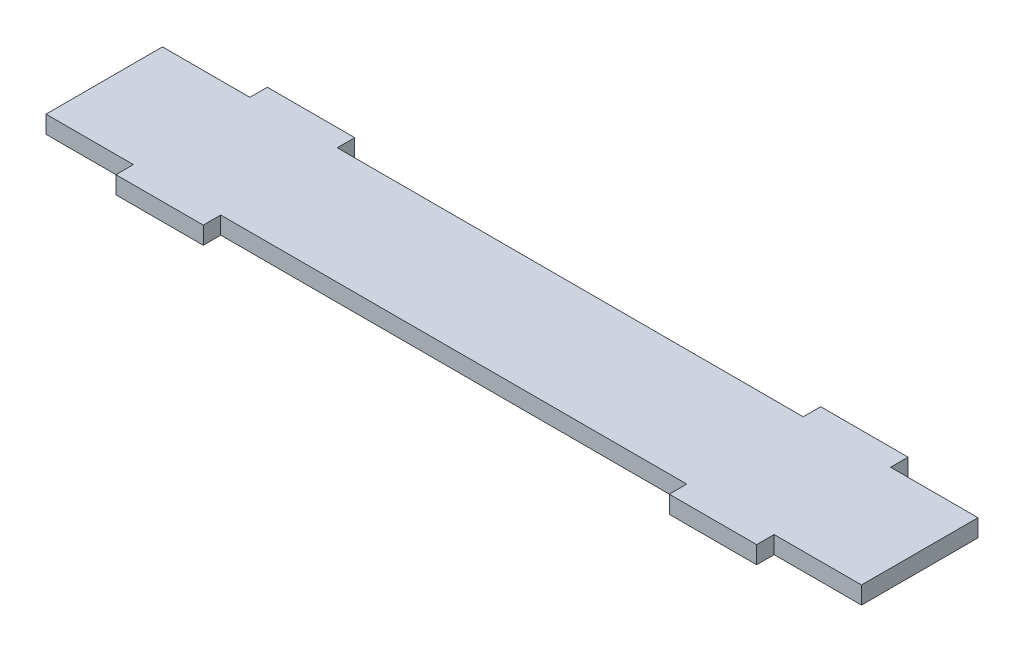
ISO-10303-21;
HEADER;
FILE_DESCRIPTION(('STEP AP214'),'2;1');
FILE_NAME('part.step','',(''),(''),'','','');
FILE_SCHEMA(('AUTOMOTIVE_DESIGN { 1 0 10303 214 1 1 1 1 }'));
ENDSEC;
DATA;
#1=APPLICATION_CONTEXT('core data for automotive mechanical design processes');
#2=APPLICATION_PROTOCOL_DEFINITION('international standard','automotive_design',2000,#1);
#3=PRODUCT_CONTEXT('',#1,'mechanical');
#4=PRODUCT('Part','Part','',(#3));
#5=PRODUCT_RELATED_PRODUCT_CATEGORY('part','',(#4));
#6=PRODUCT_DEFINITION_FORMATION('','',#4);
#7=PRODUCT_DEFINITION_CONTEXT('part definition',#1,'design');
#8=PRODUCT_DEFINITION('design','',#6,#7);
#9=PRODUCT_DEFINITION_SHAPE('','',#8);
#10=(LENGTH_UNIT() NAMED_UNIT(*) SI_UNIT(.MILLI.,.METRE.));
#11=(NAMED_UNIT(*) PLANE_ANGLE_UNIT() SI_UNIT($,.RADIAN.));
#12=(NAMED_UNIT(*) SI_UNIT($,.STERADIAN.) SOLID_ANGLE_UNIT());
#13=UNCERTAINTY_MEASURE_WITH_UNIT(LENGTH_MEASURE(1.E-05),#10,'distance_accuracy_value','');
#14=(GEOMETRIC_REPRESENTATION_CONTEXT(3) GLOBAL_UNCERTAINTY_ASSIGNED_CONTEXT((#13)) GLOBAL_UNIT_ASSIGNED_CONTEXT((#10,
#11,#12)) REPRESENTATION_CONTEXT('',''));
#15=CARTESIAN_POINT('',(0.,0.,0.));
#16=DIRECTION('',(0.,0.,1.));
#17=DIRECTION('',(1.,0.,0.));
#18=AXIS2_PLACEMENT_3D('',#15,#16,#17);
#19=CARTESIAN_POINT('',(0.,3.,10.));
#20=DIRECTION('',(0.,0.,-1.));
#21=DIRECTION('',(-1.,0.,0.));
#22=AXIS2_PLACEMENT_3D('',#19,#20,#21);
#23=PLANE('',#22);
#24=DIRECTION('',(0.,-1.,0.));
#25=VECTOR('',#24,1.);
#26=CARTESIAN_POINT('',(40.,3.,10.));
#27=LINE('',#26,#25);
#28=CARTESIAN_POINT('',(40.,3.,10.));
#29=VERTEX_POINT('',#28);
#30=CARTESIAN_POINT('',(40.,0.,10.));
#31=VERTEX_POINT('',#30);
#32=EDGE_CURVE('E111',#29,#31,#27,.T.);
#33=ORIENTED_EDGE('',*,*,#32,.F.);
#34=DIRECTION('',(1.,0.,0.));
#35=VECTOR('',#34,1.);
#36=CARTESIAN_POINT('',(0.,3.,10.));
#37=LINE('',#36,#35);
#38=CARTESIAN_POINT('',(-40.,3.,10.));
#39=VERTEX_POINT('',#38);
#40=EDGE_CURVE('E219',#39,#29,#37,.T.);
#41=ORIENTED_EDGE('',*,*,#40,.F.);
#42=DIRECTION('',(0.,-1.,0.));
#43=VECTOR('',#42,1.);
#44=CARTESIAN_POINT('',(-40.,3.,10.));
#45=LINE('',#44,#43);
#46=CARTESIAN_POINT('',(-40.,0.,10.));
#47=VERTEX_POINT('',#46);
#48=EDGE_CURVE('E213',#39,#47,#45,.T.);
#49=ORIENTED_EDGE('',*,*,#48,.T.);
#50=DIRECTION('',(1.,0.,0.));
#51=VECTOR('',#50,1.);
#52=CARTESIAN_POINT('',(0.,0.,10.));
#53=LINE('',#52,#51);
#54=EDGE_CURVE('E234',#47,#31,#53,.T.);
#55=ORIENTED_EDGE('',*,*,#54,.T.);
#56=EDGE_LOOP('',(#33,#41,#49,#55));
#57=FACE_BOUND('',#56,.T.);
#58=ADVANCED_FACE('F101',(#57),#23,.F.);
#59=CARTESIAN_POINT('',(70.,3.,0.));
#60=DIRECTION('',(1.,0.,0.));
#61=DIRECTION('',(0.,0.,-1.));
#62=AXIS2_PLACEMENT_3D('',#59,#60,#61);
#63=PLANE('',#62);
#64=DIRECTION('',(0.,0.,1.));
#65=VECTOR('',#64,1.);
#66=CARTESIAN_POINT('',(70.,0.,0.));
#67=LINE('',#66,#65);
#68=CARTESIAN_POINT('',(70.,0.,-10.));
#69=VERTEX_POINT('',#68);
#70=CARTESIAN_POINT('',(70.,0.,10.));
#71=VERTEX_POINT('',#70);
#72=EDGE_CURVE('E148',#69,#71,#67,.T.);
#73=ORIENTED_EDGE('',*,*,#72,.F.);
#74=DIRECTION('',(0.,-1.,0.));
#75=VECTOR('',#74,1.);
#76=CARTESIAN_POINT('',(70.,3.,-10.));
#77=LINE('',#76,#75);
#78=CARTESIAN_POINT('',(70.,3.,-10.));
#79=VERTEX_POINT('',#78);
#80=EDGE_CURVE('E171',#79,#69,#77,.T.);
#81=ORIENTED_EDGE('',*,*,#80,.F.);
#82=DIRECTION('',(0.,0.,1.));
#83=VECTOR('',#82,1.);
#84=CARTESIAN_POINT('',(70.,3.,0.));
#85=LINE('',#84,#83);
#86=CARTESIAN_POINT('',(70.,3.,10.));
#87=VERTEX_POINT('',#86);
#88=EDGE_CURVE('E300',#79,#87,#85,.T.);
#89=ORIENTED_EDGE('',*,*,#88,.T.);
#90=DIRECTION('',(0.,-1.,0.));
#91=VECTOR('',#90,1.);
#92=CARTESIAN_POINT('',(70.,3.,10.));
#93=LINE('',#92,#91);
#94=EDGE_CURVE('E216',#87,#71,#93,.T.);
#95=ORIENTED_EDGE('',*,*,#94,.T.);
#96=EDGE_LOOP('',(#73,#81,#89,#95));
#97=FACE_BOUND('',#96,.T.);
#98=ADVANCED_FACE('F317',(#97),#63,.T.);
#99=CARTESIAN_POINT('',(0.,3.,-10.));
#100=DIRECTION('',(0.,0.,-1.));
#101=DIRECTION('',(-1.,0.,0.));
#102=AXIS2_PLACEMENT_3D('',#99,#100,#101);
#103=PLANE('',#102);
#104=DIRECTION('',(1.,0.,0.));
#105=VECTOR('',#104,1.);
#106=CARTESIAN_POINT('',(0.,0.,-10.));
#107=LINE('',#106,#105);
#108=CARTESIAN_POINT('',(55.,0.,-10.));
#109=VERTEX_POINT('',#108);
#110=EDGE_CURVE('E257',#109,#69,#107,.T.);
#111=ORIENTED_EDGE('',*,*,#110,.F.);
#112=DIRECTION('',(0.,-1.,0.));
#113=VECTOR('',#112,1.);
#114=CARTESIAN_POINT('',(55.,3.,-10.));
#115=LINE('',#114,#113);
#116=CARTESIAN_POINT('',(55.,3.,-10.));
#117=VERTEX_POINT('',#116);
#118=EDGE_CURVE('E174',#117,#109,#115,.T.);
#119=ORIENTED_EDGE('',*,*,#118,.F.);
#120=DIRECTION('',(1.,0.,0.));
#121=VECTOR('',#120,1.);
#122=CARTESIAN_POINT('',(0.,3.,-10.));
#123=LINE('',#122,#121);
#124=EDGE_CURVE('E297',#117,#79,#123,.T.);
#125=ORIENTED_EDGE('',*,*,#124,.T.);
#126=ORIENTED_EDGE('',*,*,#80,.T.);
#127=EDGE_LOOP('',(#111,#119,#125,#126));
#128=FACE_BOUND('',#127,.T.);
#129=ADVANCED_FACE('F325',(#128),#103,.T.);
#130=CARTESIAN_POINT('',(55.,3.,0.));
#131=DIRECTION('',(-1.,0.,0.));
#132=DIRECTION('',(0.,0.,1.));
#133=AXIS2_PLACEMENT_3D('',#130,#131,#132);
#134=PLANE('',#133);
#135=DIRECTION('',(0.,0.,-1.));
#136=VECTOR('',#135,1.);
#137=CARTESIAN_POINT('',(55.,0.,0.));
#138=LINE('',#137,#136);
#139=CARTESIAN_POINT('',(55.,0.,-13.));
#140=VERTEX_POINT('',#139);
#141=EDGE_CURVE('E254',#109,#140,#138,.T.);
#142=ORIENTED_EDGE('',*,*,#141,.T.);
#143=DIRECTION('',(0.,-1.,0.));
#144=VECTOR('',#143,1.);
#145=CARTESIAN_POINT('',(55.,3.,-13.));
#146=LINE('',#145,#144);
#147=CARTESIAN_POINT('',(55.,3.,-13.));
#148=VERTEX_POINT('',#147);
#149=EDGE_CURVE('E177',#148,#140,#146,.T.);
#150=ORIENTED_EDGE('',*,*,#149,.F.);
#151=DIRECTION('',(0.,0.,-1.));
#152=VECTOR('',#151,1.);
#153=CARTESIAN_POINT('',(55.,3.,0.));
#154=LINE('',#153,#152);
#155=EDGE_CURVE('E294',#117,#148,#154,.T.);
#156=ORIENTED_EDGE('',*,*,#155,.F.);
#157=ORIENTED_EDGE('',*,*,#118,.T.);
#158=EDGE_LOOP('',(#142,#150,#156,#157));
#159=FACE_BOUND('',#158,.T.);
#160=ADVANCED_FACE('F399',(#159),#134,.F.);
#161=CARTESIAN_POINT('',(0.,3.,-13.));
#162=DIRECTION('',(0.,0.,1.));
#163=DIRECTION('',(1.,0.,0.));
#164=AXIS2_PLACEMENT_3D('',#161,#162,#163);
#165=PLANE('',#164);
#166=DIRECTION('',(-1.,0.,0.));
#167=VECTOR('',#166,1.);
#168=CARTESIAN_POINT('',(0.,0.,-13.));
#169=LINE('',#168,#167);
#170=CARTESIAN_POINT('',(40.,0.,-13.));
#171=VERTEX_POINT('',#170);
#172=EDGE_CURVE('E251',#140,#171,#169,.T.);
#173=ORIENTED_EDGE('',*,*,#172,.T.);
#174=DIRECTION('',(0.,-1.,0.));
#175=VECTOR('',#174,1.);
#176=CARTESIAN_POINT('',(40.,3.,-13.));
#177=LINE('',#176,#175);
#178=CARTESIAN_POINT('',(40.,3.,-13.));
#179=VERTEX_POINT('',#178);
#180=EDGE_CURVE('E180',#179,#171,#177,.T.);
#181=ORIENTED_EDGE('',*,*,#180,.F.);
#182=DIRECTION('',(-1.,0.,0.));
#183=VECTOR('',#182,1.);
#184=CARTESIAN_POINT('',(0.,3.,-13.));
#185=LINE('',#184,#183);
#186=EDGE_CURVE('E291',#148,#179,#185,.T.);
#187=ORIENTED_EDGE('',*,*,#186,.F.);
#188=ORIENTED_EDGE('',*,*,#149,.T.);
#189=EDGE_LOOP('',(#173,#181,#187,#188));
#190=FACE_BOUND('',#189,.T.);
#191=ADVANCED_FACE('F401',(#190),#165,.F.);
#192=CARTESIAN_POINT('',(40.,3.,0.));
#193=DIRECTION('',(-1.,0.,0.));
#194=DIRECTION('',(0.,0.,1.));
#195=AXIS2_PLACEMENT_3D('',#192,#193,#194);
#196=PLANE('',#195);
#197=DIRECTION('',(0.,0.,-1.));
#198=VECTOR('',#197,1.);
#199=CARTESIAN_POINT('',(40.,0.,0.));
#200=LINE('',#199,#198);
#201=CARTESIAN_POINT('',(40.,0.,-10.));
#202=VERTEX_POINT('',#201);
#203=EDGE_CURVE('E248',#202,#171,#200,.T.);
#204=ORIENTED_EDGE('',*,*,#203,.F.);
#205=DIRECTION('',(0.,-1.,0.));
#206=VECTOR('',#205,1.);
#207=CARTESIAN_POINT('',(40.,3.,-10.));
#208=LINE('',#207,#206);
#209=CARTESIAN_POINT('',(40.,3.,-10.));
#210=VERTEX_POINT('',#209);
#211=EDGE_CURVE('E183',#210,#202,#208,.T.);
#212=ORIENTED_EDGE('',*,*,#211,.F.);
#213=DIRECTION('',(0.,0.,-1.));
#214=VECTOR('',#213,1.);
#215=CARTESIAN_POINT('',(40.,3.,0.));
#216=LINE('',#215,#214);
#217=EDGE_CURVE('E288',#210,#179,#216,.T.);
#218=ORIENTED_EDGE('',*,*,#217,.T.);
#219=ORIENTED_EDGE('',*,*,#180,.T.);
#220=EDGE_LOOP('',(#204,#212,#218,#219));
#221=FACE_BOUND('',#220,.T.);
#222=ADVANCED_FACE('F404',(#221),#196,.T.);
#223=CARTESIAN_POINT('',(-40.,0.,-10.));
#224=VERTEX_POINT('',#223);
#225=EDGE_CURVE('E247',#224,#202,#107,.T.);
#226=ORIENTED_EDGE('',*,*,#225,.F.);
#227=DIRECTION('',(0.,-1.,0.));
#228=VECTOR('',#227,1.);
#229=CARTESIAN_POINT('',(-40.,3.,-10.));
#230=LINE('',#229,#228);
#231=CARTESIAN_POINT('',(-40.,3.,-10.));
#232=VERTEX_POINT('',#231);
#233=EDGE_CURVE('E186',#232,#224,#230,.T.);
#234=ORIENTED_EDGE('',*,*,#233,.F.);
#235=EDGE_CURVE('E287',#232,#210,#123,.T.);
#236=ORIENTED_EDGE('',*,*,#235,.T.);
#237=ORIENTED_EDGE('',*,*,#211,.T.);
#238=EDGE_LOOP('',(#226,#234,#236,#237));
#239=FACE_BOUND('',#238,.T.);
#240=ADVANCED_FACE('F409',(#239),#103,.T.);
#241=CARTESIAN_POINT('',(-40.,3.,0.));
#242=DIRECTION('',(-1.,0.,0.));
#243=DIRECTION('',(0.,0.,1.));
#244=AXIS2_PLACEMENT_3D('',#241,#242,#243);
#245=PLANE('',#244);
#246=DIRECTION('',(0.,0.,-1.));
#247=VECTOR('',#246,1.);
#248=CARTESIAN_POINT('',(-40.,0.,0.));
#249=LINE('',#248,#247);
#250=CARTESIAN_POINT('',(-40.,0.,-13.));
#251=VERTEX_POINT('',#250);
#252=EDGE_CURVE('E244',#224,#251,#249,.T.);
#253=ORIENTED_EDGE('',*,*,#252,.T.);
#254=DIRECTION('',(0.,-1.,0.));
#255=VECTOR('',#254,1.);
#256=CARTESIAN_POINT('',(-40.,3.,-13.));
#257=LINE('',#256,#255);
#258=CARTESIAN_POINT('',(-40.,3.,-13.));
#259=VERTEX_POINT('',#258);
#260=EDGE_CURVE('E189',#259,#251,#257,.T.);
#261=ORIENTED_EDGE('',*,*,#260,.F.);
#262=DIRECTION('',(0.,0.,-1.));
#263=VECTOR('',#262,1.);
#264=CARTESIAN_POINT('',(-40.,3.,0.));
#265=LINE('',#264,#263);
#266=EDGE_CURVE('E284',#232,#259,#265,.T.);
#267=ORIENTED_EDGE('',*,*,#266,.F.);
#268=ORIENTED_EDGE('',*,*,#233,.T.);
#269=EDGE_LOOP('',(#253,#261,#267,#268));
#270=FACE_BOUND('',#269,.T.);
#271=ADVANCED_FACE('F431',(#270),#245,.F.);
#272=CARTESIAN_POINT('',(0.,3.,-13.));
#273=DIRECTION('',(0.,0.,-1.));
#274=DIRECTION('',(-1.,0.,0.));
#275=AXIS2_PLACEMENT_3D('',#272,#273,#274);
#276=PLANE('',#275);
#277=DIRECTION('',(1.,0.,0.));
#278=VECTOR('',#277,1.);
#279=CARTESIAN_POINT('',(0.,0.,-13.));
#280=LINE('',#279,#278);
#281=CARTESIAN_POINT('',(-55.,0.,-13.));
#282=VERTEX_POINT('',#281);
#283=EDGE_CURVE('E241',#282,#251,#280,.T.);
#284=ORIENTED_EDGE('',*,*,#283,.F.);
#285=DIRECTION('',(0.,-1.,0.));
#286=VECTOR('',#285,1.);
#287=CARTESIAN_POINT('',(-55.,3.,-13.));
#288=LINE('',#287,#286);
#289=CARTESIAN_POINT('',(-55.,3.,-13.));
#290=VERTEX_POINT('',#289);
#291=EDGE_CURVE('E192',#290,#282,#288,.T.);
#292=ORIENTED_EDGE('',*,*,#291,.F.);
#293=DIRECTION('',(1.,0.,0.));
#294=VECTOR('',#293,1.);
#295=CARTESIAN_POINT('',(0.,3.,-13.));
#296=LINE('',#295,#294);
#297=EDGE_CURVE('E281',#290,#259,#296,.T.);
#298=ORIENTED_EDGE('',*,*,#297,.T.);
#299=ORIENTED_EDGE('',*,*,#260,.T.);
#300=EDGE_LOOP('',(#284,#292,#298,#299));
#301=FACE_BOUND('',#300,.T.);
#302=ADVANCED_FACE('F433',(#301),#276,.T.);
#303=CARTESIAN_POINT('',(-55.,3.,0.));
#304=DIRECTION('',(-1.,0.,0.));
#305=DIRECTION('',(0.,0.,1.));
#306=AXIS2_PLACEMENT_3D('',#303,#304,#305);
#307=PLANE('',#306);
#308=DIRECTION('',(0.,0.,-1.));
#309=VECTOR('',#308,1.);
#310=CARTESIAN_POINT('',(-55.,0.,0.));
#311=LINE('',#310,#309);
#312=CARTESIAN_POINT('',(-55.,0.,-10.));
#313=VERTEX_POINT('',#312);
#314=EDGE_CURVE('E238',#313,#282,#311,.T.);
#315=ORIENTED_EDGE('',*,*,#314,.F.);
#316=DIRECTION('',(0.,-1.,0.));
#317=VECTOR('',#316,1.);
#318=CARTESIAN_POINT('',(-55.,3.,-10.));
#319=LINE('',#318,#317);
#320=CARTESIAN_POINT('',(-55.,3.,-10.));
#321=VERTEX_POINT('',#320);
#322=EDGE_CURVE('E195',#321,#313,#319,.T.);
#323=ORIENTED_EDGE('',*,*,#322,.F.);
#324=DIRECTION('',(0.,0.,-1.));
#325=VECTOR('',#324,1.);
#326=CARTESIAN_POINT('',(-55.,3.,0.));
#327=LINE('',#326,#325);
#328=EDGE_CURVE('E278',#321,#290,#327,.T.);
#329=ORIENTED_EDGE('',*,*,#328,.T.);
#330=ORIENTED_EDGE('',*,*,#291,.T.);
#331=EDGE_LOOP('',(#315,#323,#329,#330));
#332=FACE_BOUND('',#331,.T.);
#333=ADVANCED_FACE('F422',(#332),#307,.T.);
#334=CARTESIAN_POINT('',(-70.,0.,-10.));
#335=VERTEX_POINT('',#334);
#336=EDGE_CURVE('E237',#335,#313,#107,.T.);
#337=ORIENTED_EDGE('',*,*,#336,.F.);
#338=DIRECTION('',(0.,-1.,0.));
#339=VECTOR('',#338,1.);
#340=CARTESIAN_POINT('',(-70.,3.,-10.));
#341=LINE('',#340,#339);
#342=CARTESIAN_POINT('',(-70.,3.,-10.));
#343=VERTEX_POINT('',#342);
#344=EDGE_CURVE('E198',#343,#335,#341,.T.);
#345=ORIENTED_EDGE('',*,*,#344,.F.);
#346=EDGE_CURVE('E277',#343,#321,#123,.T.);
#347=ORIENTED_EDGE('',*,*,#346,.T.);
#348=ORIENTED_EDGE('',*,*,#322,.T.);
#349=EDGE_LOOP('',(#337,#345,#347,#348));
#350=FACE_BOUND('',#349,.T.);
#351=ADVANCED_FACE('F415',(#350),#103,.T.);
#352=CARTESIAN_POINT('',(-70.,3.,0.));
#353=DIRECTION('',(1.,0.,0.));
#354=DIRECTION('',(0.,0.,-1.));
#355=AXIS2_PLACEMENT_3D('',#352,#353,#354);
#356=PLANE('',#355);
#357=DIRECTION('',(0.,0.,1.));
#358=VECTOR('',#357,1.);
#359=CARTESIAN_POINT('',(-70.,0.,0.));
#360=LINE('',#359,#358);
#361=CARTESIAN_POINT('',(-70.,0.,10.));
#362=VERTEX_POINT('',#361);
#363=EDGE_CURVE('E233',#335,#362,#360,.T.);
#364=ORIENTED_EDGE('',*,*,#363,.T.);
#365=DIRECTION('',(0.,-1.,0.));
#366=VECTOR('',#365,1.);
#367=CARTESIAN_POINT('',(-70.,3.,10.));
#368=LINE('',#367,#366);
#369=CARTESIAN_POINT('',(-70.,3.,10.));
#370=VERTEX_POINT('',#369);
#371=EDGE_CURVE('E201',#370,#362,#368,.T.);
#372=ORIENTED_EDGE('',*,*,#371,.F.);
#373=DIRECTION('',(0.,0.,1.));
#374=VECTOR('',#373,1.);
#375=CARTESIAN_POINT('',(-70.,3.,0.));
#376=LINE('',#375,#374);
#377=EDGE_CURVE('E274',#343,#370,#376,.T.);
#378=ORIENTED_EDGE('',*,*,#377,.F.);
#379=ORIENTED_EDGE('',*,*,#344,.T.);
#380=EDGE_LOOP('',(#364,#372,#378,#379));
#381=FACE_BOUND('',#380,.T.);
#382=ADVANCED_FACE('F468',(#381),#356,.F.);
#383=CARTESIAN_POINT('',(-55.,0.,10.));
#384=VERTEX_POINT('',#383);
#385=EDGE_CURVE('E230',#362,#384,#53,.T.);
#386=ORIENTED_EDGE('',*,*,#385,.T.);
#387=DIRECTION('',(0.,-1.,0.));
#388=VECTOR('',#387,1.);
#389=CARTESIAN_POINT('',(-55.,3.,10.));
#390=LINE('',#389,#388);
#391=CARTESIAN_POINT('',(-55.,3.,10.));
#392=VERTEX_POINT('',#391);
#393=EDGE_CURVE('E204',#392,#384,#390,.T.);
#394=ORIENTED_EDGE('',*,*,#393,.F.);
#395=EDGE_CURVE('E271',#370,#392,#37,.T.);
#396=ORIENTED_EDGE('',*,*,#395,.F.);
#397=ORIENTED_EDGE('',*,*,#371,.T.);
#398=EDGE_LOOP('',(#386,#394,#396,#397));
#399=FACE_BOUND('',#398,.T.);
#400=ADVANCED_FACE('F531',(#399),#23,.F.);
#401=CARTESIAN_POINT('',(-55.,3.,0.));
#402=DIRECTION('',(1.,0.,0.));
#403=DIRECTION('',(0.,0.,-1.));
#404=AXIS2_PLACEMENT_3D('',#401,#402,#403);
#405=PLANE('',#404);
#406=DIRECTION('',(0.,0.,1.));
#407=VECTOR('',#406,1.);
#408=CARTESIAN_POINT('',(-55.,0.,0.));
#409=LINE('',#408,#407);
#410=CARTESIAN_POINT('',(-55.,0.,13.));
#411=VERTEX_POINT('',#410);
#412=EDGE_CURVE('E227',#384,#411,#409,.T.);
#413=ORIENTED_EDGE('',*,*,#412,.T.);
#414=DIRECTION('',(0.,-1.,0.));
#415=VECTOR('',#414,1.);
#416=CARTESIAN_POINT('',(-55.,3.,13.));
#417=LINE('',#416,#415);
#418=CARTESIAN_POINT('',(-55.,3.,13.));
#419=VERTEX_POINT('',#418);
#420=EDGE_CURVE('E207',#419,#411,#417,.T.);
#421=ORIENTED_EDGE('',*,*,#420,.F.);
#422=DIRECTION('',(0.,0.,1.));
#423=VECTOR('',#422,1.);
#424=CARTESIAN_POINT('',(-55.,3.,0.));
#425=LINE('',#424,#423);
#426=EDGE_CURVE('E268',#392,#419,#425,.T.);
#427=ORIENTED_EDGE('',*,*,#426,.F.);
#428=ORIENTED_EDGE('',*,*,#393,.T.);
#429=EDGE_LOOP('',(#413,#421,#427,#428));
#430=FACE_BOUND('',#429,.T.);
#431=ADVANCED_FACE('F542',(#430),#405,.F.);
#432=CARTESIAN_POINT('',(0.,3.,13.));
#433=DIRECTION('',(0.,0.,-1.));
#434=DIRECTION('',(-1.,0.,0.));
#435=AXIS2_PLACEMENT_3D('',#432,#433,#434);
#436=PLANE('',#435);
#437=DIRECTION('',(1.,0.,0.));
#438=VECTOR('',#437,1.);
#439=CARTESIAN_POINT('',(0.,0.,13.));
#440=LINE('',#439,#438);
#441=CARTESIAN_POINT('',(-40.,0.,13.));
#442=VERTEX_POINT('',#441);
#443=EDGE_CURVE('E224',#411,#442,#440,.T.);
#444=ORIENTED_EDGE('',*,*,#443,.T.);
#445=DIRECTION('',(0.,-1.,0.));
#446=VECTOR('',#445,1.);
#447=CARTESIAN_POINT('',(-40.,3.,13.));
#448=LINE('',#447,#446);
#449=CARTESIAN_POINT('',(-40.,3.,13.));
#450=VERTEX_POINT('',#449);
#451=EDGE_CURVE('E210',#450,#442,#448,.T.);
#452=ORIENTED_EDGE('',*,*,#451,.F.);
#453=DIRECTION('',(1.,0.,0.));
#454=VECTOR('',#453,1.);
#455=CARTESIAN_POINT('',(0.,3.,13.));
#456=LINE('',#455,#454);
#457=EDGE_CURVE('E265',#419,#450,#456,.T.);
#458=ORIENTED_EDGE('',*,*,#457,.F.);
#459=ORIENTED_EDGE('',*,*,#420,.T.);
#460=EDGE_LOOP('',(#444,#452,#458,#459));
#461=FACE_BOUND('',#460,.T.);
#462=ADVANCED_FACE('F553',(#461),#436,.F.);
#463=CARTESIAN_POINT('',(-40.,3.,0.));
#464=DIRECTION('',(1.,0.,0.));
#465=DIRECTION('',(0.,0.,-1.));
#466=AXIS2_PLACEMENT_3D('',#463,#464,#465);
#467=PLANE('',#466);
#468=DIRECTION('',(0.,0.,1.));
#469=VECTOR('',#468,1.);
#470=CARTESIAN_POINT('',(-40.,0.,0.));
#471=LINE('',#470,#469);
#472=EDGE_CURVE('E220',#47,#442,#471,.T.);
#473=ORIENTED_EDGE('',*,*,#472,.F.);
#474=ORIENTED_EDGE('',*,*,#48,.F.);
#475=DIRECTION('',(0.,0.,1.));
#476=VECTOR('',#475,1.);
#477=CARTESIAN_POINT('',(-40.,3.,0.));
#478=LINE('',#477,#476);
#479=EDGE_CURVE('E261',#39,#450,#478,.T.);
#480=ORIENTED_EDGE('',*,*,#479,.T.);
#481=ORIENTED_EDGE('',*,*,#451,.T.);
#482=EDGE_LOOP('',(#473,#474,#480,#481));
#483=FACE_BOUND('',#482,.T.);
#484=ADVANCED_FACE('F564',(#483),#467,.T.);
#485=CARTESIAN_POINT('',(55.,3.,10.));
#486=VERTEX_POINT('',#485);
#487=EDGE_CURVE('E264',#486,#87,#37,.T.);
#488=ORIENTED_EDGE('',*,*,#487,.F.);
#489=DIRECTION('',(0.,-1.,0.));
#490=VECTOR('',#489,1.);
#491=CARTESIAN_POINT('',(55.,3.,10.));
#492=LINE('',#491,#490);
#493=CARTESIAN_POINT('',(55.,0.,10.));
#494=VERTEX_POINT('',#493);
#495=EDGE_CURVE('E12',#486,#494,#492,.T.);
#496=ORIENTED_EDGE('',*,*,#495,.T.);
#497=EDGE_CURVE('E223',#494,#71,#53,.T.);
#498=ORIENTED_EDGE('',*,*,#497,.T.);
#499=ORIENTED_EDGE('',*,*,#94,.F.);
#500=EDGE_LOOP('',(#488,#496,#498,#499));
#501=FACE_BOUND('',#500,.T.);
#502=ADVANCED_FACE('F312',(#501),#23,.F.);
#503=CARTESIAN_POINT('',(0.,3.,0.));
#504=DIRECTION('',(0.,1.,0.));
#505=DIRECTION('',(0.,0.,1.));
#506=AXIS2_PLACEMENT_3D('',#503,#504,#505);
#507=PLANE('',#506);
#508=ORIENTED_EDGE('',*,*,#88,.F.);
#509=ORIENTED_EDGE('',*,*,#124,.F.);
#510=ORIENTED_EDGE('',*,*,#155,.T.);
#511=ORIENTED_EDGE('',*,*,#186,.T.);
#512=ORIENTED_EDGE('',*,*,#217,.F.);
#513=ORIENTED_EDGE('',*,*,#235,.F.);
#514=ORIENTED_EDGE('',*,*,#266,.T.);
#515=ORIENTED_EDGE('',*,*,#297,.F.);
#516=ORIENTED_EDGE('',*,*,#328,.F.);
#517=ORIENTED_EDGE('',*,*,#346,.F.);
#518=ORIENTED_EDGE('',*,*,#377,.T.);
#519=ORIENTED_EDGE('',*,*,#395,.T.);
#520=ORIENTED_EDGE('',*,*,#426,.T.);
#521=ORIENTED_EDGE('',*,*,#457,.T.);
#522=ORIENTED_EDGE('',*,*,#479,.F.);
#523=ORIENTED_EDGE('',*,*,#40,.T.);
#524=DIRECTION('',(0.,0.,1.));
#525=VECTOR('',#524,1.);
#526=CARTESIAN_POINT('',(40.,3.,10.));
#527=LINE('',#526,#525);
#528=CARTESIAN_POINT('',(40.,3.,13.));
#529=VERTEX_POINT('',#528);
#530=EDGE_CURVE('E166',#29,#529,#527,.T.);
#531=ORIENTED_EDGE('',*,*,#530,.T.);
#532=DIRECTION('',(-1.,0.,0.));
#533=VECTOR('',#532,1.);
#534=CARTESIAN_POINT('',(55.,3.,13.));
#535=LINE('',#534,#533);
#536=CARTESIAN_POINT('',(55.,3.,13.));
#537=VERTEX_POINT('',#536);
#538=EDGE_CURVE('E145',#537,#529,#535,.T.);
#539=ORIENTED_EDGE('',*,*,#538,.F.);
#540=DIRECTION('',(0.,0.,1.));
#541=VECTOR('',#540,1.);
#542=CARTESIAN_POINT('',(55.,3.,10.));
#543=LINE('',#542,#541);
#544=EDGE_CURVE('E157',#486,#537,#543,.T.);
#545=ORIENTED_EDGE('',*,*,#544,.F.);
#546=ORIENTED_EDGE('',*,*,#487,.T.);
#547=EDGE_LOOP('',(#508,#509,#510,#511,#512,#513,#514,#515,#516,#517,#518,#519,#520,#521,#522,
#523,#531,#539,#545,#546));
#548=FACE_BOUND('',#547,.T.);
#549=ADVANCED_FACE('F394',(#548),#507,.T.);
#550=CARTESIAN_POINT('',(0.,0.,0.));
#551=DIRECTION('',(0.,1.,0.));
#552=DIRECTION('',(0.,0.,1.));
#553=AXIS2_PLACEMENT_3D('',#550,#551,#552);
#554=PLANE('',#553);
#555=ORIENTED_EDGE('',*,*,#72,.T.);
#556=ORIENTED_EDGE('',*,*,#497,.F.);
#557=DIRECTION('',(0.,0.,1.));
#558=VECTOR('',#557,1.);
#559=CARTESIAN_POINT('',(55.,0.,10.));
#560=LINE('',#559,#558);
#561=CARTESIAN_POINT('',(55.,0.,13.));
#562=VERTEX_POINT('',#561);
#563=EDGE_CURVE('E162',#494,#562,#560,.T.);
#564=ORIENTED_EDGE('',*,*,#563,.T.);
#565=DIRECTION('',(-1.,0.,0.));
#566=VECTOR('',#565,1.);
#567=CARTESIAN_POINT('',(55.,0.,13.));
#568=LINE('',#567,#566);
#569=CARTESIAN_POINT('',(40.,0.,13.));
#570=VERTEX_POINT('',#569);
#571=EDGE_CURVE('E142',#562,#570,#568,.T.);
#572=ORIENTED_EDGE('',*,*,#571,.T.);
#573=DIRECTION('',(0.,0.,1.));
#574=VECTOR('',#573,1.);
#575=CARTESIAN_POINT('',(40.,0.,10.));
#576=LINE('',#575,#574);
#577=EDGE_CURVE('E151',#31,#570,#576,.T.);
#578=ORIENTED_EDGE('',*,*,#577,.F.);
#579=ORIENTED_EDGE('',*,*,#54,.F.);
#580=ORIENTED_EDGE('',*,*,#472,.T.);
#581=ORIENTED_EDGE('',*,*,#443,.F.);
#582=ORIENTED_EDGE('',*,*,#412,.F.);
#583=ORIENTED_EDGE('',*,*,#385,.F.);
#584=ORIENTED_EDGE('',*,*,#363,.F.);
#585=ORIENTED_EDGE('',*,*,#336,.T.);
#586=ORIENTED_EDGE('',*,*,#314,.T.);
#587=ORIENTED_EDGE('',*,*,#283,.T.);
#588=ORIENTED_EDGE('',*,*,#252,.F.);
#589=ORIENTED_EDGE('',*,*,#225,.T.);
#590=ORIENTED_EDGE('',*,*,#203,.T.);
#591=ORIENTED_EDGE('',*,*,#172,.F.);
#592=ORIENTED_EDGE('',*,*,#141,.F.);
#593=ORIENTED_EDGE('',*,*,#110,.T.);
#594=EDGE_LOOP('',(#555,#556,#564,#572,#578,#579,#580,#581,#582,#583,#584,#585,#586,#587,#588,
#589,#590,#591,#592,#593));
#595=FACE_BOUND('',#594,.T.);
#596=ADVANCED_FACE('F160',(#595),#554,.F.);
#597=CARTESIAN_POINT('',(40.,3.,10.));
#598=DIRECTION('',(1.,0.,0.));
#599=DIRECTION('',(0.,0.,-1.));
#600=AXIS2_PLACEMENT_3D('',#597,#598,#599);
#601=PLANE('',#600);
#602=ORIENTED_EDGE('',*,*,#577,.T.);
#603=DIRECTION('',(0.,-1.,0.));
#604=VECTOR('',#603,1.);
#605=CARTESIAN_POINT('',(40.,3.,13.));
#606=LINE('',#605,#604);
#607=EDGE_CURVE('E138',#529,#570,#606,.T.);
#608=ORIENTED_EDGE('',*,*,#607,.F.);
#609=ORIENTED_EDGE('',*,*,#530,.F.);
#610=ORIENTED_EDGE('',*,*,#32,.T.);
#611=EDGE_LOOP('',(#602,#608,#609,#610));
#612=FACE_BOUND('',#611,.T.);
#613=ADVANCED_FACE('F152',(#612),#601,.F.);
#614=CARTESIAN_POINT('',(55.,3.,13.));
#615=DIRECTION('',(0.,0.,1.));
#616=DIRECTION('',(1.,0.,0.));
#617=AXIS2_PLACEMENT_3D('',#614,#615,#616);
#618=PLANE('',#617);
#619=ORIENTED_EDGE('',*,*,#571,.F.);
#620=DIRECTION('',(0.,-1.,0.));
#621=VECTOR('',#620,1.);
#622=CARTESIAN_POINT('',(55.,3.,13.));
#623=LINE('',#622,#621);
#624=EDGE_CURVE('E105',#537,#562,#623,.T.);
#625=ORIENTED_EDGE('',*,*,#624,.F.);
#626=ORIENTED_EDGE('',*,*,#538,.T.);
#627=ORIENTED_EDGE('',*,*,#607,.T.);
#628=EDGE_LOOP('',(#619,#625,#626,#627));
#629=FACE_BOUND('',#628,.T.);
#630=ADVANCED_FACE('F140',(#629),#618,.T.);
#631=CARTESIAN_POINT('',(55.,3.,10.));
#632=DIRECTION('',(1.,0.,0.));
#633=DIRECTION('',(0.,0.,-1.));
#634=AXIS2_PLACEMENT_3D('',#631,#632,#633);
#635=PLANE('',#634);
#636=ORIENTED_EDGE('',*,*,#563,.F.);
#637=ORIENTED_EDGE('',*,*,#495,.F.);
#638=ORIENTED_EDGE('',*,*,#544,.T.);
#639=ORIENTED_EDGE('',*,*,#624,.T.);
#640=EDGE_LOOP('',(#636,#637,#638,#639));
#641=FACE_BOUND('',#640,.T.);
#642=ADVANCED_FACE('F103',(#641),#635,.T.);
#643=CLOSED_SHELL('',(#58,#98,#129,#160,#191,#222,#240,#271,#302,#333,#351,#382,#400,#431,#462,
#484,#502,#549,#596,#613,#630,#642));
#644=MANIFOLD_SOLID_BREP('B2',#643);
#645=ADVANCED_BREP_SHAPE_REPRESENTATION('',(#18,#644),#14);
#646=SHAPE_DEFINITION_REPRESENTATION(#9,#645);
ENDSEC;
END-ISO-10303-21;
